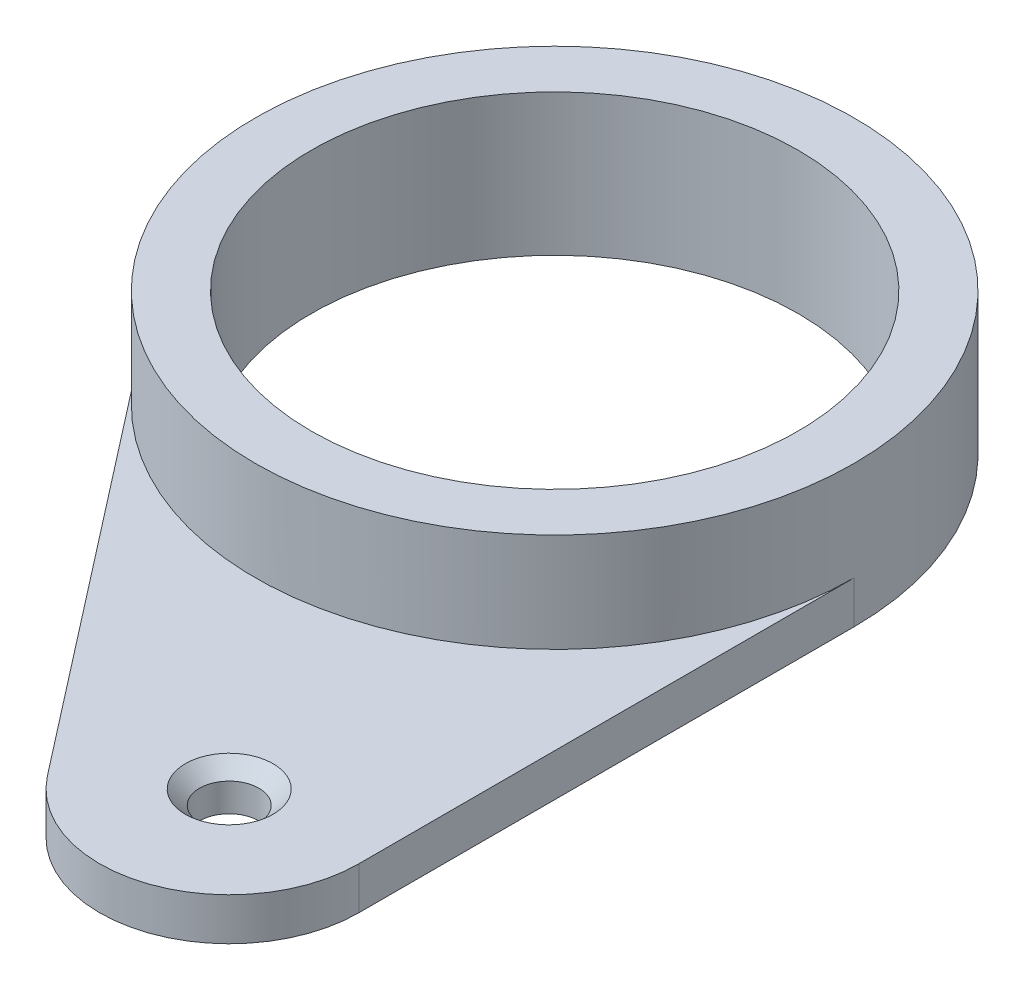
ISO-10303-21;
HEADER;
FILE_DESCRIPTION(('STEP AP214'),'2;1');
FILE_NAME('part.step','',(''),(''),'','','');
FILE_SCHEMA(('AUTOMOTIVE_DESIGN { 1 0 10303 214 1 1 1 1 }'));
ENDSEC;
DATA;
#1=APPLICATION_CONTEXT('core data for automotive mechanical design processes');
#2=APPLICATION_PROTOCOL_DEFINITION('international standard','automotive_design',2000,#1);
#3=PRODUCT_CONTEXT('',#1,'mechanical');
#4=PRODUCT('Part','Part','',(#3));
#5=PRODUCT_RELATED_PRODUCT_CATEGORY('part','',(#4));
#6=PRODUCT_DEFINITION_FORMATION('','',#4);
#7=PRODUCT_DEFINITION_CONTEXT('part definition',#1,'design');
#8=PRODUCT_DEFINITION('design','',#6,#7);
#9=PRODUCT_DEFINITION_SHAPE('','',#8);
#10=(LENGTH_UNIT() NAMED_UNIT(*) SI_UNIT(.MILLI.,.METRE.));
#11=(NAMED_UNIT(*) PLANE_ANGLE_UNIT() SI_UNIT($,.RADIAN.));
#12=(NAMED_UNIT(*) SI_UNIT($,.STERADIAN.) SOLID_ANGLE_UNIT());
#13=UNCERTAINTY_MEASURE_WITH_UNIT(LENGTH_MEASURE(1.E-05),#10,'distance_accuracy_value','');
#14=(GEOMETRIC_REPRESENTATION_CONTEXT(3) GLOBAL_UNCERTAINTY_ASSIGNED_CONTEXT((#13)) GLOBAL_UNIT_ASSIGNED_CONTEXT((#10,
#11,#12)) REPRESENTATION_CONTEXT('',''));
#15=CARTESIAN_POINT('',(0.,0.,0.));
#16=DIRECTION('',(0.,0.,1.));
#17=DIRECTION('',(1.,0.,0.));
#18=AXIS2_PLACEMENT_3D('',#15,#16,#17);
#19=CARTESIAN_POINT('',(-12.,3.,-35.));
#20=DIRECTION('',(0.,-1.,0.));
#21=DIRECTION('',(0.,0.,-1.));
#22=AXIS2_PLACEMENT_3D('',#19,#20,#21);
#23=CYLINDRICAL_SURFACE('',#22,21.1549715887557);
#24=CARTESIAN_POINT('',(-12.,0.,-35.));
#25=DIRECTION('',(0.,1.,0.));
#26=DIRECTION('',(0.,0.,1.));
#27=AXIS2_PLACEMENT_3D('',#24,#25,#26);
#28=CIRCLE('',#27,21.1549715887557);
#29=CARTESIAN_POINT('',(-29.2270529303201,0.,-22.7215037461011));
#30=VERTEX_POINT('',#29);
#31=CARTESIAN_POINT('',(9.15497158875568,0.,-35.));
#32=VERTEX_POINT('',#31);
#33=EDGE_CURVE('E124',#30,#32,#28,.F.);
#34=ORIENTED_EDGE('',*,*,#33,.F.);
#35=DIRECTION('',(0.,-1.,0.));
#36=VECTOR('',#35,1.);
#37=CARTESIAN_POINT('',(-29.2270529303201,3.,-22.7215037461011));
#38=LINE('',#37,#36);
#39=CARTESIAN_POINT('',(-29.2270529303201,3.,-22.7215037461011));
#40=VERTEX_POINT('',#39);
#41=EDGE_CURVE('E116',#40,#30,#38,.T.);
#42=ORIENTED_EDGE('',*,*,#41,.F.);
#43=CARTESIAN_POINT('',(-12.,3.,-35.));
#44=DIRECTION('',(0.,1.,0.));
#45=DIRECTION('',(0.,0.,1.));
#46=AXIS2_PLACEMENT_3D('',#43,#44,#45);
#47=CIRCLE('',#46,21.1549715887557);
#48=CARTESIAN_POINT('',(-28.1672346298479,3.,-21.3561974748786));
#49=VERTEX_POINT('',#48);
#50=EDGE_CURVE('E57',#40,#49,#47,.T.);
#51=ORIENTED_EDGE('',*,*,#50,.T.);
#52=CARTESIAN_POINT('',(9.15497158875568,3.,-35.));
#53=VERTEX_POINT('',#52);
#54=EDGE_CURVE('E11',#49,#53,#47,.T.);
#55=ORIENTED_EDGE('',*,*,#54,.T.);
#56=DIRECTION('',(0.,-1.,0.));
#57=VECTOR('',#56,1.);
#58=CARTESIAN_POINT('',(9.15497158875568,3.,-35.));
#59=LINE('',#58,#57);
#60=EDGE_CURVE('E91',#53,#32,#59,.T.);
#61=ORIENTED_EDGE('',*,*,#60,.T.);
#62=EDGE_LOOP('',(#34,#42,#51,#55,#61));
#63=FACE_BOUND('',#62,.T.);
#64=CARTESIAN_POINT('',(-12.,10.,-35.));
#65=DIRECTION('',(0.,1.,0.));
#66=DIRECTION('',(0.,0.,1.));
#67=AXIS2_PLACEMENT_3D('',#64,#65,#66);
#68=CIRCLE('',#67,21.1549715887557);
#69=CARTESIAN_POINT('',(-12.,10.,-13.8450284112443));
#70=VERTEX_POINT('',#69);
#71=EDGE_CURVE('E119',#70,#70,#68,.T.);
#72=ORIENTED_EDGE('',*,*,#71,.F.);
#73=EDGE_LOOP('',(#72));
#74=FACE_BOUND('',#73,.T.);
#75=ADVANCED_FACE('F45',(#63,#74),#23,.T.);
#76=CARTESIAN_POINT('',(-7.23184997063129,3.,5.61371987128001));
#77=DIRECTION('',(-0.789936910291845,0.,0.613188125911268));
#78=DIRECTION('',(0.613188125911268,0.,0.789936910291845));
#79=AXIS2_PLACEMENT_3D('',#76,#77,#78);
#80=PLANE('',#79);
#81=DIRECTION('',(-0.613188125911268,0.,-0.789936910291845));
#82=VECTOR('',#81,1.);
#83=CARTESIAN_POINT('',(-7.23184997063129,0.,5.61371987128001));
#84=LINE('',#83,#82);
#85=CARTESIAN_POINT('',(-7.23184997063129,0.,5.61371987128001));
#86=VERTEX_POINT('',#85);
#87=EDGE_CURVE('E136',#86,#30,#84,.T.);
#88=ORIENTED_EDGE('',*,*,#87,.F.);
#89=DIRECTION('',(0.,-1.,0.));
#90=VECTOR('',#89,1.);
#91=CARTESIAN_POINT('',(-7.23184997063129,3.,5.61371987128001));
#92=LINE('',#91,#90);
#93=CARTESIAN_POINT('',(-7.23184997063129,3.,5.61371987128001));
#94=VERTEX_POINT('',#93);
#95=EDGE_CURVE('E156',#94,#86,#92,.T.);
#96=ORIENTED_EDGE('',*,*,#95,.F.);
#97=DIRECTION('',(-0.613188125911268,0.,-0.789936910291845));
#98=VECTOR('',#97,1.);
#99=CARTESIAN_POINT('',(-7.23184997063129,3.,5.61371987128001));
#100=LINE('',#99,#98);
#101=EDGE_CURVE('E129',#94,#49,#100,.T.);
#102=ORIENTED_EDGE('',*,*,#101,.T.);
#103=EDGE_CURVE('E96',#49,#40,#100,.T.);
#104=ORIENTED_EDGE('',*,*,#103,.T.);
#105=ORIENTED_EDGE('',*,*,#41,.T.);
#106=EDGE_LOOP('',(#88,#96,#102,#104,#105));
#107=FACE_BOUND('',#106,.T.);
#108=ADVANCED_FACE('F183',(#107),#80,.T.);
#109=CARTESIAN_POINT('',(0.,3.,0.));
#110=DIRECTION('',(0.,-1.,0.));
#111=DIRECTION('',(0.,0.,-1.));
#112=AXIS2_PLACEMENT_3D('',#109,#110,#111);
#113=CYLINDRICAL_SURFACE('',#112,9.15497158875568);
#114=CARTESIAN_POINT('',(0.,0.,0.));
#115=DIRECTION('',(0.,1.,0.));
#116=DIRECTION('',(0.,0.,1.));
#117=AXIS2_PLACEMENT_3D('',#114,#115,#116);
#118=CIRCLE('',#117,9.15497158875568);
#119=CARTESIAN_POINT('',(9.15497158875568,0.,0.));
#120=VERTEX_POINT('',#119);
#121=EDGE_CURVE('E140',#120,#86,#118,.F.);
#122=ORIENTED_EDGE('',*,*,#121,.F.);
#123=DIRECTION('',(0.,-1.,0.));
#124=VECTOR('',#123,1.);
#125=CARTESIAN_POINT('',(9.15497158875568,3.,0.));
#126=LINE('',#125,#124);
#127=CARTESIAN_POINT('',(9.15497158875568,3.,0.));
#128=VERTEX_POINT('',#127);
#129=EDGE_CURVE('E71',#128,#120,#126,.T.);
#130=ORIENTED_EDGE('',*,*,#129,.F.);
#131=CARTESIAN_POINT('',(0.,3.,0.));
#132=DIRECTION('',(0.,1.,0.));
#133=DIRECTION('',(0.,0.,1.));
#134=AXIS2_PLACEMENT_3D('',#131,#132,#133);
#135=CIRCLE('',#134,9.15497158875568);
#136=EDGE_CURVE('E110',#128,#94,#135,.F.);
#137=ORIENTED_EDGE('',*,*,#136,.T.);
#138=ORIENTED_EDGE('',*,*,#95,.T.);
#139=EDGE_LOOP('',(#122,#130,#137,#138));
#140=FACE_BOUND('',#139,.T.);
#141=ADVANCED_FACE('F187',(#140),#113,.T.);
#142=CARTESIAN_POINT('',(-12.,3.,-35.));
#143=DIRECTION('',(0.,-1.,0.));
#144=DIRECTION('',(0.,0.,-1.));
#145=AXIS2_PLACEMENT_3D('',#142,#143,#144);
#146=CYLINDRICAL_SURFACE('',#145,17.2);
#147=CARTESIAN_POINT('',(-12.,0.,-35.));
#148=DIRECTION('',(0.,1.,0.));
#149=DIRECTION('',(0.,0.,1.));
#150=AXIS2_PLACEMENT_3D('',#147,#148,#149);
#151=CIRCLE('',#150,17.2);
#152=CARTESIAN_POINT('',(-12.,0.,-17.8));
#153=VERTEX_POINT('',#152);
#154=EDGE_CURVE('E146',#153,#153,#151,.T.);
#155=ORIENTED_EDGE('',*,*,#154,.F.);
#156=EDGE_LOOP('',(#155));
#157=FACE_BOUND('',#156,.T.);
#158=CARTESIAN_POINT('',(-12.,10.,-35.));
#159=DIRECTION('',(0.,1.,0.));
#160=DIRECTION('',(0.,0.,1.));
#161=AXIS2_PLACEMENT_3D('',#158,#159,#160);
#162=CIRCLE('',#161,17.2);
#163=CARTESIAN_POINT('',(-12.,10.,-17.8));
#164=VERTEX_POINT('',#163);
#165=EDGE_CURVE('E120',#164,#164,#162,.T.);
#166=ORIENTED_EDGE('',*,*,#165,.T.);
#167=EDGE_LOOP('',(#166));
#168=FACE_BOUND('',#167,.T.);
#169=ADVANCED_FACE('F192',(#157,#168),#146,.F.);
#170=CARTESIAN_POINT('',(9.15497158875568,3.,0.));
#171=DIRECTION('',(-1.,0.,0.));
#172=DIRECTION('',(0.,0.,1.));
#173=AXIS2_PLACEMENT_3D('',#170,#171,#172);
#174=PLANE('',#173);
#175=DIRECTION('',(0.,0.,-1.));
#176=VECTOR('',#175,1.);
#177=CARTESIAN_POINT('',(9.15497158875568,0.,0.));
#178=LINE('',#177,#176);
#179=EDGE_CURVE('E104',#120,#32,#178,.T.);
#180=ORIENTED_EDGE('',*,*,#179,.T.);
#181=ORIENTED_EDGE('',*,*,#60,.F.);
#182=DIRECTION('',(0.,0.,-1.));
#183=VECTOR('',#182,1.);
#184=CARTESIAN_POINT('',(9.15497158875568,3.,0.));
#185=LINE('',#184,#183);
#186=EDGE_CURVE('E101',#128,#53,#185,.T.);
#187=ORIENTED_EDGE('',*,*,#186,.F.);
#188=ORIENTED_EDGE('',*,*,#129,.T.);
#189=EDGE_LOOP('',(#180,#181,#187,#188));
#190=FACE_BOUND('',#189,.T.);
#191=ADVANCED_FACE('F100',(#190),#174,.F.);
#192=CARTESIAN_POINT('',(0.,3.,0.));
#193=DIRECTION('',(0.,-1.,0.));
#194=DIRECTION('',(0.,0.,-1.));
#195=AXIS2_PLACEMENT_3D('',#192,#193,#194);
#196=CYLINDRICAL_SURFACE('',#195,2.1);
#197=CARTESIAN_POINT('',(0.,1.99999999999999,0.));
#198=DIRECTION('',(0.,1.,0.));
#199=DIRECTION('',(0.,0.,1.));
#200=AXIS2_PLACEMENT_3D('',#197,#198,#199);
#201=CIRCLE('',#200,2.1);
#202=CARTESIAN_POINT('',(0.,1.99999999999999,2.1));
#203=VERTEX_POINT('',#202);
#204=EDGE_CURVE('E160',#203,#203,#201,.T.);
#205=ORIENTED_EDGE('',*,*,#204,.T.);
#206=EDGE_LOOP('',(#205));
#207=FACE_BOUND('',#206,.T.);
#208=CARTESIAN_POINT('',(0.,0.,0.));
#209=DIRECTION('',(0.,1.,0.));
#210=DIRECTION('',(0.,0.,1.));
#211=AXIS2_PLACEMENT_3D('',#208,#209,#210);
#212=CIRCLE('',#211,2.1);
#213=CARTESIAN_POINT('',(0.,0.,2.1));
#214=VERTEX_POINT('',#213);
#215=EDGE_CURVE('E150',#214,#214,#212,.T.);
#216=ORIENTED_EDGE('',*,*,#215,.F.);
#217=EDGE_LOOP('',(#216));
#218=FACE_BOUND('',#217,.T.);
#219=ADVANCED_FACE('F195',(#207,#218),#196,.F.);
#220=CARTESIAN_POINT('',(0.,3.,0.));
#221=DIRECTION('',(0.,1.,0.));
#222=DIRECTION('',(0.,0.,1.));
#223=AXIS2_PLACEMENT_3D('',#220,#221,#222);
#224=PLANE('',#223);
#225=ORIENTED_EDGE('',*,*,#54,.F.);
#226=ORIENTED_EDGE('',*,*,#101,.F.);
#227=ORIENTED_EDGE('',*,*,#136,.F.);
#228=ORIENTED_EDGE('',*,*,#186,.T.);
#229=EDGE_LOOP('',(#225,#226,#227,#228));
#230=FACE_BOUND('',#229,.T.);
#231=CARTESIAN_POINT('',(0.,3.,0.));
#232=DIRECTION('',(0.,1.,0.));
#233=DIRECTION('',(0.,0.,1.));
#234=AXIS2_PLACEMENT_3D('',#231,#232,#233);
#235=CIRCLE('',#234,3.10000000000001);
#236=CARTESIAN_POINT('',(0.,3.,3.10000000000001));
#237=VERTEX_POINT('',#236);
#238=EDGE_CURVE('E50',#237,#237,#235,.F.);
#239=ORIENTED_EDGE('',*,*,#238,.T.);
#240=EDGE_LOOP('',(#239));
#241=FACE_BOUND('',#240,.T.);
#242=ADVANCED_FACE('F108',(#230,#241),#224,.T.);
#243=CARTESIAN_POINT('',(0.,0.,0.));
#244=DIRECTION('',(0.,1.,0.));
#245=DIRECTION('',(0.,0.,1.));
#246=AXIS2_PLACEMENT_3D('',#243,#244,#245);
#247=PLANE('',#246);
#248=ORIENTED_EDGE('',*,*,#33,.T.);
#249=ORIENTED_EDGE('',*,*,#179,.F.);
#250=ORIENTED_EDGE('',*,*,#121,.T.);
#251=ORIENTED_EDGE('',*,*,#87,.T.);
#252=EDGE_LOOP('',(#248,#249,#250,#251));
#253=FACE_BOUND('',#252,.T.);
#254=ORIENTED_EDGE('',*,*,#154,.T.);
#255=EDGE_LOOP('',(#254));
#256=FACE_BOUND('',#255,.T.);
#257=ORIENTED_EDGE('',*,*,#215,.T.);
#258=EDGE_LOOP('',(#257));
#259=FACE_BOUND('',#258,.T.);
#260=ADVANCED_FACE('F172',(#253,#256,#259),#247,.F.);
#261=CARTESIAN_POINT('',(0.,1.99999999999999,0.));
#262=DIRECTION('',(0.,1.,0.));
#263=DIRECTION('',(0.,0.,1.));
#264=AXIS2_PLACEMENT_3D('',#261,#262,#263);
#265=CONICAL_SURFACE('',#264,2.1,0.785398163397452);
#266=ORIENTED_EDGE('',*,*,#238,.F.);
#267=EDGE_LOOP('',(#266));
#268=FACE_BOUND('',#267,.T.);
#269=ORIENTED_EDGE('',*,*,#204,.F.);
#270=EDGE_LOOP('',(#269));
#271=FACE_BOUND('',#270,.T.);
#272=ADVANCED_FACE('F48',(#268,#271),#265,.F.);
#273=CARTESIAN_POINT('',(-12.,10.,-35.));
#274=DIRECTION('',(0.,1.,0.));
#275=DIRECTION('',(0.,0.,1.));
#276=AXIS2_PLACEMENT_3D('',#273,#274,#275);
#277=PLANE('',#276);
#278=ORIENTED_EDGE('',*,*,#71,.T.);
#279=EDGE_LOOP('',(#278));
#280=FACE_BOUND('',#279,.T.);
#281=ORIENTED_EDGE('',*,*,#165,.F.);
#282=EDGE_LOOP('',(#281));
#283=FACE_BOUND('',#282,.T.);
#284=ADVANCED_FACE('F171',(#280,#283),#277,.T.);
#285=CARTESIAN_POINT('',(-12.,3.,-35.));
#286=DIRECTION('',(0.,1.,0.));
#287=DIRECTION('',(0.,0.,1.));
#288=AXIS2_PLACEMENT_3D('',#285,#286,#287);
#289=PLANE('',#288);
#290=ORIENTED_EDGE('',*,*,#103,.F.);
#291=ORIENTED_EDGE('',*,*,#50,.F.);
#292=EDGE_LOOP('',(#290,#291));
#293=FACE_BOUND('',#292,.T.);
#294=ADVANCED_FACE('F177',(#293),#289,.F.);
#295=CLOSED_SHELL('',(#75,#108,#141,#169,#191,#219,#242,#260,#272,#284,#294));
#296=MANIFOLD_SOLID_BREP('B2',#295);
#297=ADVANCED_BREP_SHAPE_REPRESENTATION('',(#18,#296),#14);
#298=SHAPE_DEFINITION_REPRESENTATION(#9,#297);
ENDSEC;
END-ISO-10303-21;
